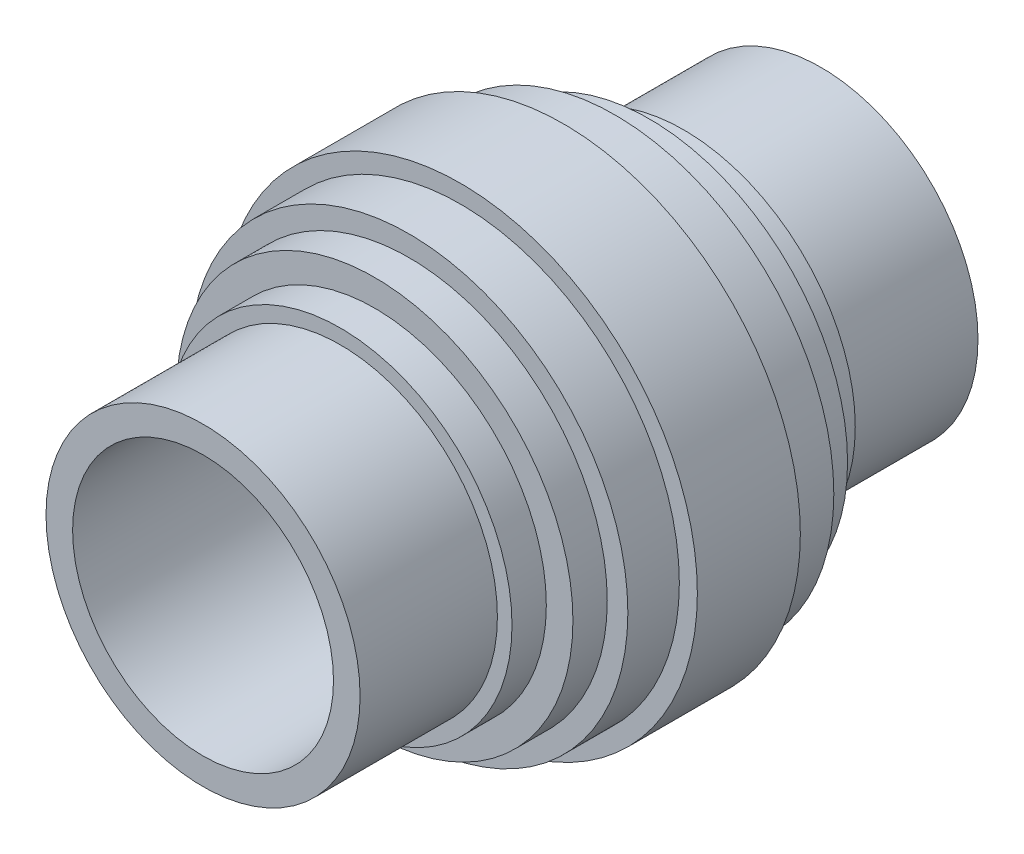
ISO-10303-21;
HEADER;
FILE_DESCRIPTION(('STEP AP214'),'2;1');
FILE_NAME('part.step','',(''),(''),'','','');
FILE_SCHEMA(('AUTOMOTIVE_DESIGN { 1 0 10303 214 1 1 1 1 }'));
ENDSEC;
DATA;
#1=APPLICATION_CONTEXT('core data for automotive mechanical design processes');
#2=APPLICATION_PROTOCOL_DEFINITION('international standard','automotive_design',2000,#1);
#3=PRODUCT_CONTEXT('',#1,'mechanical');
#4=PRODUCT('Part','Part','',(#3));
#5=PRODUCT_RELATED_PRODUCT_CATEGORY('part','',(#4));
#6=PRODUCT_DEFINITION_FORMATION('','',#4);
#7=PRODUCT_DEFINITION_CONTEXT('part definition',#1,'design');
#8=PRODUCT_DEFINITION('design','',#6,#7);
#9=PRODUCT_DEFINITION_SHAPE('','',#8);
#10=(LENGTH_UNIT() NAMED_UNIT(*) SI_UNIT(.MILLI.,.METRE.));
#11=(NAMED_UNIT(*) PLANE_ANGLE_UNIT() SI_UNIT($,.RADIAN.));
#12=(NAMED_UNIT(*) SI_UNIT($,.STERADIAN.) SOLID_ANGLE_UNIT());
#13=UNCERTAINTY_MEASURE_WITH_UNIT(LENGTH_MEASURE(1.E-05),#10,'distance_accuracy_value','');
#14=(GEOMETRIC_REPRESENTATION_CONTEXT(3) GLOBAL_UNCERTAINTY_ASSIGNED_CONTEXT((#13)) GLOBAL_UNIT_ASSIGNED_CONTEXT((#10,
#11,#12)) REPRESENTATION_CONTEXT('',''));
#15=CARTESIAN_POINT('',(0.,0.,0.));
#16=DIRECTION('',(0.,0.,1.));
#17=DIRECTION('',(1.,0.,0.));
#18=AXIS2_PLACEMENT_3D('',#15,#16,#17);
#19=CARTESIAN_POINT('',(0.,0.,-3.6));
#20=DIRECTION('',(0.,0.,1.));
#21=DIRECTION('',(1.,0.,0.));
#22=AXIS2_PLACEMENT_3D('',#19,#20,#21);
#23=PLANE('',#22);
#24=CARTESIAN_POINT('',(0.,0.,-3.6));
#25=DIRECTION('',(0.,0.,1.));
#26=DIRECTION('',(1.,0.,0.));
#27=AXIS2_PLACEMENT_3D('',#24,#25,#26);
#28=CIRCLE('',#27,1.83);
#29=CARTESIAN_POINT('',(1.83,0.,-3.6));
#30=VERTEX_POINT('',#29);
#31=EDGE_CURVE('E41',#30,#30,#28,.T.);
#32=ORIENTED_EDGE('',*,*,#31,.F.);
#33=EDGE_LOOP('',(#32));
#34=FACE_BOUND('',#33,.T.);
#35=CARTESIAN_POINT('',(0.,0.,-3.6));
#36=DIRECTION('',(0.,0.,1.));
#37=DIRECTION('',(1.,0.,0.));
#38=AXIS2_PLACEMENT_3D('',#35,#36,#37);
#39=CIRCLE('',#38,1.52);
#40=CARTESIAN_POINT('',(1.52,0.,-3.6));
#41=VERTEX_POINT('',#40);
#42=EDGE_CURVE('E92',#41,#41,#39,.T.);
#43=ORIENTED_EDGE('',*,*,#42,.T.);
#44=EDGE_LOOP('',(#43));
#45=FACE_BOUND('',#44,.T.);
#46=ADVANCED_FACE('F40',(#34,#45),#23,.F.);
#47=CARTESIAN_POINT('',(0.,0.,-2.));
#48=DIRECTION('',(0.,0.,-1.));
#49=DIRECTION('',(-1.,0.,0.));
#50=AXIS2_PLACEMENT_3D('',#47,#48,#49);
#51=CYLINDRICAL_SURFACE('',#50,1.83);
#52=CARTESIAN_POINT('',(0.,0.,-2.));
#53=DIRECTION('',(0.,0.,1.));
#54=DIRECTION('',(1.,0.,0.));
#55=AXIS2_PLACEMENT_3D('',#52,#53,#54);
#56=CIRCLE('',#55,1.83);
#57=CARTESIAN_POINT('',(1.83,0.,-2.));
#58=VERTEX_POINT('',#57);
#59=EDGE_CURVE('E71',#58,#58,#56,.T.);
#60=ORIENTED_EDGE('',*,*,#59,.F.);
#61=EDGE_LOOP('',(#60));
#62=FACE_BOUND('',#61,.T.);
#63=ORIENTED_EDGE('',*,*,#31,.T.);
#64=EDGE_LOOP('',(#63));
#65=FACE_BOUND('',#64,.T.);
#66=ADVANCED_FACE('F39',(#62,#65),#51,.T.);
#67=CARTESIAN_POINT('',(0.,0.,-2.));
#68=DIRECTION('',(0.,0.,-1.));
#69=DIRECTION('',(-1.,0.,0.));
#70=AXIS2_PLACEMENT_3D('',#67,#68,#69);
#71=CYLINDRICAL_SURFACE('',#70,1.52);
#72=ORIENTED_EDGE('',*,*,#42,.F.);
#73=EDGE_LOOP('',(#72));
#74=FACE_BOUND('',#73,.T.);
#75=CARTESIAN_POINT('',(0.,0.,3.6));
#76=DIRECTION('',(0.,0.,1.));
#77=DIRECTION('',(1.,0.,0.));
#78=AXIS2_PLACEMENT_3D('',#75,#76,#77);
#79=CIRCLE('',#78,1.52);
#80=CARTESIAN_POINT('',(1.52,0.,3.6));
#81=VERTEX_POINT('',#80);
#82=EDGE_CURVE('E114',#81,#81,#79,.T.);
#83=ORIENTED_EDGE('',*,*,#82,.T.);
#84=EDGE_LOOP('',(#83));
#85=FACE_BOUND('',#84,.T.);
#86=ADVANCED_FACE('F108',(#74,#85),#71,.F.);
#87=CARTESIAN_POINT('',(0.,0.,-2.));
#88=DIRECTION('',(0.,0.,1.));
#89=DIRECTION('',(1.,0.,0.));
#90=AXIS2_PLACEMENT_3D('',#87,#88,#89);
#91=PLANE('',#90);
#92=ORIENTED_EDGE('',*,*,#59,.T.);
#93=EDGE_LOOP('',(#92));
#94=FACE_BOUND('',#93,.T.);
#95=CARTESIAN_POINT('',(0.,0.,-2.));
#96=DIRECTION('',(0.,0.,1.));
#97=DIRECTION('',(1.,0.,0.));
#98=AXIS2_PLACEMENT_3D('',#95,#96,#97);
#99=CIRCLE('',#98,2.);
#100=CARTESIAN_POINT('',(2.,0.,-2.));
#101=VERTEX_POINT('',#100);
#102=EDGE_CURVE('E90',#101,#101,#99,.T.);
#103=ORIENTED_EDGE('',*,*,#102,.F.);
#104=EDGE_LOOP('',(#103));
#105=FACE_BOUND('',#104,.T.);
#106=ADVANCED_FACE('F111',(#94,#105),#91,.F.);
#107=CARTESIAN_POINT('',(0.,0.,-1.6));
#108=DIRECTION('',(0.,0.,-1.));
#109=DIRECTION('',(-1.,0.,0.));
#110=AXIS2_PLACEMENT_3D('',#107,#108,#109);
#111=CYLINDRICAL_SURFACE('',#110,2.);
#112=CARTESIAN_POINT('',(0.,0.,-1.6));
#113=DIRECTION('',(0.,0.,1.));
#114=DIRECTION('',(1.,0.,0.));
#115=AXIS2_PLACEMENT_3D('',#112,#113,#114);
#116=CIRCLE('',#115,2.);
#117=CARTESIAN_POINT('',(2.,0.,-1.6));
#118=VERTEX_POINT('',#117);
#119=EDGE_CURVE('E89',#118,#118,#116,.T.);
#120=ORIENTED_EDGE('',*,*,#119,.F.);
#121=EDGE_LOOP('',(#120));
#122=FACE_BOUND('',#121,.T.);
#123=ORIENTED_EDGE('',*,*,#102,.T.);
#124=EDGE_LOOP('',(#123));
#125=FACE_BOUND('',#124,.T.);
#126=ADVANCED_FACE('F178',(#122,#125),#111,.T.);
#127=CARTESIAN_POINT('',(0.,0.,-1.6));
#128=DIRECTION('',(0.,0.,1.));
#129=DIRECTION('',(1.,0.,0.));
#130=AXIS2_PLACEMENT_3D('',#127,#128,#129);
#131=PLANE('',#130);
#132=ORIENTED_EDGE('',*,*,#119,.T.);
#133=EDGE_LOOP('',(#132));
#134=FACE_BOUND('',#133,.T.);
#135=CARTESIAN_POINT('',(0.,0.,-1.6));
#136=DIRECTION('',(0.,0.,1.));
#137=DIRECTION('',(1.,0.,0.));
#138=AXIS2_PLACEMENT_3D('',#135,#136,#137);
#139=CIRCLE('',#138,2.31);
#140=CARTESIAN_POINT('',(2.31,0.,-1.6));
#141=VERTEX_POINT('',#140);
#142=EDGE_CURVE('E82',#141,#141,#139,.T.);
#143=ORIENTED_EDGE('',*,*,#142,.F.);
#144=EDGE_LOOP('',(#143));
#145=FACE_BOUND('',#144,.T.);
#146=ADVANCED_FACE('F174',(#134,#145),#131,.F.);
#147=CARTESIAN_POINT('',(0.,0.,-1.2));
#148=DIRECTION('',(0.,0.,-1.));
#149=DIRECTION('',(-1.,0.,0.));
#150=AXIS2_PLACEMENT_3D('',#147,#148,#149);
#151=CYLINDRICAL_SURFACE('',#150,2.31);
#152=CARTESIAN_POINT('',(0.,0.,-1.2));
#153=DIRECTION('',(0.,0.,1.));
#154=DIRECTION('',(1.,0.,0.));
#155=AXIS2_PLACEMENT_3D('',#152,#153,#154);
#156=CIRCLE('',#155,2.31);
#157=CARTESIAN_POINT('',(2.31,0.,-1.2));
#158=VERTEX_POINT('',#157);
#159=EDGE_CURVE('E81',#158,#158,#156,.T.);
#160=ORIENTED_EDGE('',*,*,#159,.F.);
#161=EDGE_LOOP('',(#160));
#162=FACE_BOUND('',#161,.T.);
#163=ORIENTED_EDGE('',*,*,#142,.T.);
#164=EDGE_LOOP('',(#163));
#165=FACE_BOUND('',#164,.T.);
#166=ADVANCED_FACE('F167',(#162,#165),#151,.T.);
#167=CARTESIAN_POINT('',(0.,0.,-1.2));
#168=DIRECTION('',(0.,0.,1.));
#169=DIRECTION('',(1.,0.,0.));
#170=AXIS2_PLACEMENT_3D('',#167,#168,#169);
#171=PLANE('',#170);
#172=ORIENTED_EDGE('',*,*,#159,.T.);
#173=EDGE_LOOP('',(#172));
#174=FACE_BOUND('',#173,.T.);
#175=CARTESIAN_POINT('',(0.,0.,-1.2));
#176=DIRECTION('',(0.,0.,1.));
#177=DIRECTION('',(1.,0.,0.));
#178=AXIS2_PLACEMENT_3D('',#175,#176,#177);
#179=CIRCLE('',#178,2.55);
#180=CARTESIAN_POINT('',(2.55,0.,-1.2));
#181=VERTEX_POINT('',#180);
#182=EDGE_CURVE('E74',#181,#181,#179,.T.);
#183=ORIENTED_EDGE('',*,*,#182,.F.);
#184=EDGE_LOOP('',(#183));
#185=FACE_BOUND('',#184,.T.);
#186=ADVANCED_FACE('F170',(#174,#185),#171,.F.);
#187=CARTESIAN_POINT('',(0.,0.,-0.6));
#188=DIRECTION('',(0.,0.,-1.));
#189=DIRECTION('',(-1.,0.,0.));
#190=AXIS2_PLACEMENT_3D('',#187,#188,#189);
#191=CYLINDRICAL_SURFACE('',#190,2.55);
#192=CARTESIAN_POINT('',(0.,0.,-0.6));
#193=DIRECTION('',(0.,0.,1.));
#194=DIRECTION('',(1.,0.,0.));
#195=AXIS2_PLACEMENT_3D('',#192,#193,#194);
#196=CIRCLE('',#195,2.55);
#197=CARTESIAN_POINT('',(2.55,0.,-0.6));
#198=VERTEX_POINT('',#197);
#199=EDGE_CURVE('E76',#198,#198,#196,.T.);
#200=ORIENTED_EDGE('',*,*,#199,.F.);
#201=EDGE_LOOP('',(#200));
#202=FACE_BOUND('',#201,.T.);
#203=ORIENTED_EDGE('',*,*,#182,.T.);
#204=EDGE_LOOP('',(#203));
#205=FACE_BOUND('',#204,.T.);
#206=ADVANCED_FACE('F158',(#202,#205),#191,.T.);
#207=CARTESIAN_POINT('',(0.,0.,0.6));
#208=DIRECTION('',(0.,0.,1.));
#209=DIRECTION('',(1.,0.,0.));
#210=AXIS2_PLACEMENT_3D('',#207,#208,#209);
#211=PLANE('',#210);
#212=CARTESIAN_POINT('',(0.,0.,0.6));
#213=DIRECTION('',(0.,0.,1.));
#214=DIRECTION('',(1.,0.,0.));
#215=AXIS2_PLACEMENT_3D('',#212,#213,#214);
#216=CIRCLE('',#215,2.55);
#217=CARTESIAN_POINT('',(2.55,0.,0.6));
#218=VERTEX_POINT('',#217);
#219=EDGE_CURVE('E63',#218,#218,#216,.T.);
#220=ORIENTED_EDGE('',*,*,#219,.F.);
#221=EDGE_LOOP('',(#220));
#222=FACE_BOUND('',#221,.T.);
#223=CARTESIAN_POINT('',(0.,0.,0.6));
#224=DIRECTION('',(0.,0.,1.));
#225=DIRECTION('',(1.,0.,0.));
#226=AXIS2_PLACEMENT_3D('',#223,#224,#225);
#227=CIRCLE('',#226,2.76);
#228=CARTESIAN_POINT('',(2.76,0.,0.6));
#229=VERTEX_POINT('',#228);
#230=EDGE_CURVE('E75',#229,#229,#227,.T.);
#231=ORIENTED_EDGE('',*,*,#230,.T.);
#232=EDGE_LOOP('',(#231));
#233=FACE_BOUND('',#232,.T.);
#234=ADVANCED_FACE('F154',(#222,#233),#211,.T.);
#235=CARTESIAN_POINT('',(0.,0.,-0.6));
#236=DIRECTION('',(0.,0.,1.));
#237=DIRECTION('',(1.,0.,0.));
#238=AXIS2_PLACEMENT_3D('',#235,#236,#237);
#239=PLANE('',#238);
#240=ORIENTED_EDGE('',*,*,#199,.T.);
#241=EDGE_LOOP('',(#240));
#242=FACE_BOUND('',#241,.T.);
#243=CARTESIAN_POINT('',(0.,0.,-0.6));
#244=DIRECTION('',(0.,0.,1.));
#245=DIRECTION('',(1.,0.,0.));
#246=AXIS2_PLACEMENT_3D('',#243,#244,#245);
#247=CIRCLE('',#246,2.76);
#248=CARTESIAN_POINT('',(2.76,0.,-0.6));
#249=VERTEX_POINT('',#248);
#250=EDGE_CURVE('E67',#249,#249,#247,.T.);
#251=ORIENTED_EDGE('',*,*,#250,.F.);
#252=EDGE_LOOP('',(#251));
#253=FACE_BOUND('',#252,.T.);
#254=ADVANCED_FACE('F157',(#242,#253),#239,.F.);
#255=CARTESIAN_POINT('',(0.,0.,0.6));
#256=DIRECTION('',(0.,0.,-1.));
#257=DIRECTION('',(-1.,0.,0.));
#258=AXIS2_PLACEMENT_3D('',#255,#256,#257);
#259=CYLINDRICAL_SURFACE('',#258,2.76);
#260=ORIENTED_EDGE('',*,*,#230,.F.);
#261=EDGE_LOOP('',(#260));
#262=FACE_BOUND('',#261,.T.);
#263=ORIENTED_EDGE('',*,*,#250,.T.);
#264=EDGE_LOOP('',(#263));
#265=FACE_BOUND('',#264,.T.);
#266=ADVANCED_FACE('F148',(#262,#265),#259,.T.);
#267=CARTESIAN_POINT('',(0.,0.,1.2));
#268=DIRECTION('',(0.,0.,1.));
#269=DIRECTION('',(1.,0.,0.));
#270=AXIS2_PLACEMENT_3D('',#267,#268,#269);
#271=PLANE('',#270);
#272=CARTESIAN_POINT('',(0.,0.,1.2));
#273=DIRECTION('',(0.,0.,1.));
#274=DIRECTION('',(1.,0.,0.));
#275=AXIS2_PLACEMENT_3D('',#272,#273,#274);
#276=CIRCLE('',#275,2.31);
#277=CARTESIAN_POINT('',(2.31,0.,1.2));
#278=VERTEX_POINT('',#277);
#279=EDGE_CURVE('E49',#278,#278,#276,.T.);
#280=ORIENTED_EDGE('',*,*,#279,.F.);
#281=EDGE_LOOP('',(#280));
#282=FACE_BOUND('',#281,.T.);
#283=CARTESIAN_POINT('',(0.,0.,1.2));
#284=DIRECTION('',(0.,0.,1.));
#285=DIRECTION('',(1.,0.,0.));
#286=AXIS2_PLACEMENT_3D('',#283,#284,#285);
#287=CIRCLE('',#286,2.55);
#288=CARTESIAN_POINT('',(2.55,0.,1.2));
#289=VERTEX_POINT('',#288);
#290=EDGE_CURVE('E65',#289,#289,#287,.T.);
#291=ORIENTED_EDGE('',*,*,#290,.T.);
#292=EDGE_LOOP('',(#291));
#293=FACE_BOUND('',#292,.T.);
#294=ADVANCED_FACE('F150',(#282,#293),#271,.T.);
#295=CARTESIAN_POINT('',(0.,0.,1.2));
#296=DIRECTION('',(0.,0.,-1.));
#297=DIRECTION('',(-1.,0.,0.));
#298=AXIS2_PLACEMENT_3D('',#295,#296,#297);
#299=CYLINDRICAL_SURFACE('',#298,2.55);
#300=ORIENTED_EDGE('',*,*,#290,.F.);
#301=EDGE_LOOP('',(#300));
#302=FACE_BOUND('',#301,.T.);
#303=ORIENTED_EDGE('',*,*,#219,.T.);
#304=EDGE_LOOP('',(#303));
#305=FACE_BOUND('',#304,.T.);
#306=ADVANCED_FACE('F145',(#302,#305),#299,.T.);
#307=CARTESIAN_POINT('',(0.,0.,1.6));
#308=DIRECTION('',(0.,0.,1.));
#309=DIRECTION('',(1.,0.,0.));
#310=AXIS2_PLACEMENT_3D('',#307,#308,#309);
#311=PLANE('',#310);
#312=CARTESIAN_POINT('',(0.,0.,1.6));
#313=DIRECTION('',(0.,0.,1.));
#314=DIRECTION('',(1.,0.,0.));
#315=AXIS2_PLACEMENT_3D('',#312,#313,#314);
#316=CIRCLE('',#315,2.);
#317=CARTESIAN_POINT('',(2.,0.,1.6));
#318=VERTEX_POINT('',#317);
#319=EDGE_CURVE('E44',#318,#318,#316,.T.);
#320=ORIENTED_EDGE('',*,*,#319,.F.);
#321=EDGE_LOOP('',(#320));
#322=FACE_BOUND('',#321,.T.);
#323=CARTESIAN_POINT('',(0.,0.,1.6));
#324=DIRECTION('',(0.,0.,1.));
#325=DIRECTION('',(1.,0.,0.));
#326=AXIS2_PLACEMENT_3D('',#323,#324,#325);
#327=CIRCLE('',#326,2.31);
#328=CARTESIAN_POINT('',(2.31,0.,1.6));
#329=VERTEX_POINT('',#328);
#330=EDGE_CURVE('E59',#329,#329,#327,.T.);
#331=ORIENTED_EDGE('',*,*,#330,.T.);
#332=EDGE_LOOP('',(#331));
#333=FACE_BOUND('',#332,.T.);
#334=ADVANCED_FACE('F138',(#322,#333),#311,.T.);
#335=CARTESIAN_POINT('',(0.,0.,1.6));
#336=DIRECTION('',(0.,0.,-1.));
#337=DIRECTION('',(-1.,0.,0.));
#338=AXIS2_PLACEMENT_3D('',#335,#336,#337);
#339=CYLINDRICAL_SURFACE('',#338,2.31);
#340=ORIENTED_EDGE('',*,*,#330,.F.);
#341=EDGE_LOOP('',(#340));
#342=FACE_BOUND('',#341,.T.);
#343=ORIENTED_EDGE('',*,*,#279,.T.);
#344=EDGE_LOOP('',(#343));
#345=FACE_BOUND('',#344,.T.);
#346=ADVANCED_FACE('F133',(#342,#345),#339,.T.);
#347=CARTESIAN_POINT('',(0.,0.,2.));
#348=DIRECTION('',(0.,0.,1.));
#349=DIRECTION('',(1.,0.,0.));
#350=AXIS2_PLACEMENT_3D('',#347,#348,#349);
#351=PLANE('',#350);
#352=CARTESIAN_POINT('',(0.,0.,2.));
#353=DIRECTION('',(0.,0.,1.));
#354=DIRECTION('',(1.,0.,0.));
#355=AXIS2_PLACEMENT_3D('',#352,#353,#354);
#356=CIRCLE('',#355,1.83);
#357=CARTESIAN_POINT('',(1.83,0.,2.));
#358=VERTEX_POINT('',#357);
#359=EDGE_CURVE('E10',#358,#358,#356,.T.);
#360=ORIENTED_EDGE('',*,*,#359,.F.);
#361=EDGE_LOOP('',(#360));
#362=FACE_BOUND('',#361,.T.);
#363=CARTESIAN_POINT('',(0.,0.,2.));
#364=DIRECTION('',(0.,0.,1.));
#365=DIRECTION('',(1.,0.,0.));
#366=AXIS2_PLACEMENT_3D('',#363,#364,#365);
#367=CIRCLE('',#366,2.);
#368=CARTESIAN_POINT('',(2.,0.,2.));
#369=VERTEX_POINT('',#368);
#370=EDGE_CURVE('E57',#369,#369,#367,.T.);
#371=ORIENTED_EDGE('',*,*,#370,.T.);
#372=EDGE_LOOP('',(#371));
#373=FACE_BOUND('',#372,.T.);
#374=ADVANCED_FACE('F131',(#362,#373),#351,.T.);
#375=CARTESIAN_POINT('',(0.,0.,2.));
#376=DIRECTION('',(0.,0.,-1.));
#377=DIRECTION('',(-1.,0.,0.));
#378=AXIS2_PLACEMENT_3D('',#375,#376,#377);
#379=CYLINDRICAL_SURFACE('',#378,2.);
#380=ORIENTED_EDGE('',*,*,#370,.F.);
#381=EDGE_LOOP('',(#380));
#382=FACE_BOUND('',#381,.T.);
#383=ORIENTED_EDGE('',*,*,#319,.T.);
#384=EDGE_LOOP('',(#383));
#385=FACE_BOUND('',#384,.T.);
#386=ADVANCED_FACE('F129',(#382,#385),#379,.T.);
#387=CARTESIAN_POINT('',(0.,0.,3.6));
#388=DIRECTION('',(0.,0.,1.));
#389=DIRECTION('',(1.,0.,0.));
#390=AXIS2_PLACEMENT_3D('',#387,#388,#389);
#391=PLANE('',#390);
#392=CARTESIAN_POINT('',(0.,0.,3.6));
#393=DIRECTION('',(0.,0.,1.));
#394=DIRECTION('',(1.,0.,0.));
#395=AXIS2_PLACEMENT_3D('',#392,#393,#394);
#396=CIRCLE('',#395,1.83);
#397=CARTESIAN_POINT('',(1.83,0.,3.6));
#398=VERTEX_POINT('',#397);
#399=EDGE_CURVE('E53',#398,#398,#396,.T.);
#400=ORIENTED_EDGE('',*,*,#399,.T.);
#401=EDGE_LOOP('',(#400));
#402=FACE_BOUND('',#401,.T.);
#403=ORIENTED_EDGE('',*,*,#82,.F.);
#404=EDGE_LOOP('',(#403));
#405=FACE_BOUND('',#404,.T.);
#406=ADVANCED_FACE('F119',(#402,#405),#391,.T.);
#407=CARTESIAN_POINT('',(0.,0.,3.6));
#408=DIRECTION('',(0.,0.,-1.));
#409=DIRECTION('',(-1.,0.,0.));
#410=AXIS2_PLACEMENT_3D('',#407,#408,#409);
#411=CYLINDRICAL_SURFACE('',#410,1.83);
#412=ORIENTED_EDGE('',*,*,#399,.F.);
#413=EDGE_LOOP('',(#412));
#414=FACE_BOUND('',#413,.T.);
#415=ORIENTED_EDGE('',*,*,#359,.T.);
#416=EDGE_LOOP('',(#415));
#417=FACE_BOUND('',#416,.T.);
#418=ADVANCED_FACE('F125',(#414,#417),#411,.T.);
#419=CLOSED_SHELL('',(#46,#66,#86,#106,#126,#146,#166,#186,#206,#234,#254,#266,#294,#306,#334,
#346,#374,#386,#406,#418));
#420=MANIFOLD_SOLID_BREP('B2',#419);
#421=ADVANCED_BREP_SHAPE_REPRESENTATION('',(#18,#420),#14);
#422=SHAPE_DEFINITION_REPRESENTATION(#9,#421);
ENDSEC;
END-ISO-10303-21;
